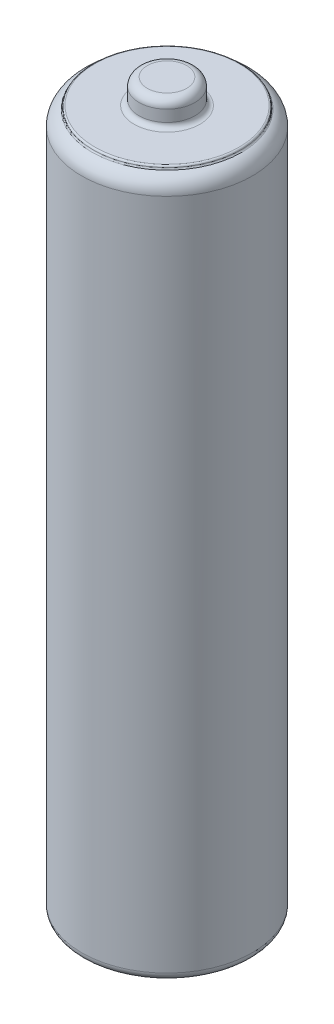
ISO-10303-21;
HEADER;
FILE_DESCRIPTION(('STEP AP214'),'2;1');
FILE_NAME('part.step','',(''),(''),'','','');
FILE_SCHEMA(('AUTOMOTIVE_DESIGN { 1 0 10303 214 1 1 1 1 }'));
ENDSEC;
DATA;
#1=APPLICATION_CONTEXT('core data for automotive mechanical design processes');
#2=APPLICATION_PROTOCOL_DEFINITION('international standard','automotive_design',2000,#1);
#3=PRODUCT_CONTEXT('',#1,'mechanical');
#4=PRODUCT('Part','Part','',(#3));
#5=PRODUCT_RELATED_PRODUCT_CATEGORY('part','',(#4));
#6=PRODUCT_DEFINITION_FORMATION('','',#4);
#7=PRODUCT_DEFINITION_CONTEXT('part definition',#1,'design');
#8=PRODUCT_DEFINITION('design','',#6,#7);
#9=PRODUCT_DEFINITION_SHAPE('','',#8);
#10=(LENGTH_UNIT() NAMED_UNIT(*) SI_UNIT(.MILLI.,.METRE.));
#11=(NAMED_UNIT(*) PLANE_ANGLE_UNIT() SI_UNIT($,.RADIAN.));
#12=(NAMED_UNIT(*) SI_UNIT($,.STERADIAN.) SOLID_ANGLE_UNIT());
#13=UNCERTAINTY_MEASURE_WITH_UNIT(LENGTH_MEASURE(1.E-05),#10,'distance_accuracy_value','');
#14=(GEOMETRIC_REPRESENTATION_CONTEXT(3) GLOBAL_UNCERTAINTY_ASSIGNED_CONTEXT((#13)) GLOBAL_UNIT_ASSIGNED_CONTEXT((#10,
#11,#12)) REPRESENTATION_CONTEXT('',''));
#15=CARTESIAN_POINT('',(0.,0.,0.));
#16=DIRECTION('',(0.,0.,1.));
#17=DIRECTION('',(1.,0.,0.));
#18=AXIS2_PLACEMENT_3D('',#15,#16,#17);
#19=CARTESIAN_POINT('',(0.,42.6,0.));
#20=DIRECTION('',(0.,1.,0.));
#21=DIRECTION('',(0.,0.,1.));
#22=AXIS2_PLACEMENT_3D('',#19,#20,#21);
#23=PLANE('',#22);
#24=CARTESIAN_POINT('',(0.,42.6,0.));
#25=DIRECTION('',(0.,1.,0.));
#26=DIRECTION('',(0.,0.,1.));
#27=AXIS2_PLACEMENT_3D('',#24,#25,#26);
#28=CIRCLE('',#27,2.);
#29=CARTESIAN_POINT('',(0.,42.6,2.));
#30=VERTEX_POINT('',#29);
#31=EDGE_CURVE('E53',#30,#30,#28,.F.);
#32=ORIENTED_EDGE('',*,*,#31,.T.);
#33=EDGE_LOOP('',(#32));
#34=FACE_BOUND('',#33,.T.);
#35=CARTESIAN_POINT('',(0.,42.6,0.));
#36=DIRECTION('',(0.,1.,0.));
#37=DIRECTION('',(0.,0.,1.));
#38=AXIS2_PLACEMENT_3D('',#35,#36,#37);
#39=CIRCLE('',#38,4.4);
#40=CARTESIAN_POINT('',(0.,42.6,4.4));
#41=VERTEX_POINT('',#40);
#42=EDGE_CURVE('E65',#41,#41,#39,.T.);
#43=ORIENTED_EDGE('',*,*,#42,.T.);
#44=EDGE_LOOP('',(#43));
#45=FACE_BOUND('',#44,.T.);
#46=ADVANCED_FACE('F33',(#34,#45),#23,.T.);
#47=CARTESIAN_POINT('',(0.,0.,0.));
#48=DIRECTION('',(0.,1.,0.));
#49=DIRECTION('',(0.,0.,1.));
#50=AXIS2_PLACEMENT_3D('',#47,#48,#49);
#51=PLANE('',#50);
#52=CARTESIAN_POINT('',(0.,0.,0.));
#53=DIRECTION('',(0.,1.,0.));
#54=DIRECTION('',(0.,0.,1.));
#55=AXIS2_PLACEMENT_3D('',#52,#53,#54);
#56=CIRCLE('',#55,4.7);
#57=CARTESIAN_POINT('',(0.,0.,4.7));
#58=VERTEX_POINT('',#57);
#59=EDGE_CURVE('E10',#58,#58,#56,.F.);
#60=ORIENTED_EDGE('',*,*,#59,.T.);
#61=EDGE_LOOP('',(#60));
#62=FACE_BOUND('',#61,.T.);
#63=CARTESIAN_POINT('',(0.,0.,0.));
#64=DIRECTION('',(0.,1.,0.));
#65=DIRECTION('',(0.,0.,1.));
#66=AXIS2_PLACEMENT_3D('',#63,#64,#65);
#67=CIRCLE('',#66,4.5);
#68=CARTESIAN_POINT('',(0.,0.,4.5));
#69=VERTEX_POINT('',#68);
#70=EDGE_CURVE('E77',#69,#69,#67,.F.);
#71=ORIENTED_EDGE('',*,*,#70,.F.);
#72=EDGE_LOOP('',(#71));
#73=FACE_BOUND('',#72,.T.);
#74=ADVANCED_FACE('F83',(#62,#73),#51,.F.);
#75=CARTESIAN_POINT('',(0.,42.4,0.));
#76=DIRECTION('',(0.,-1.,0.));
#77=DIRECTION('',(0.,0.,-1.));
#78=AXIS2_PLACEMENT_3D('',#75,#76,#77);
#79=CYLINDRICAL_SURFACE('',#78,5.2);
#80=CARTESIAN_POINT('',(0.,0.5,0.));
#81=DIRECTION('',(0.,1.,0.));
#82=DIRECTION('',(0.,0.,1.));
#83=AXIS2_PLACEMENT_3D('',#80,#81,#82);
#84=CIRCLE('',#83,5.2);
#85=CARTESIAN_POINT('',(0.,0.5,5.2));
#86=VERTEX_POINT('',#85);
#87=EDGE_CURVE('E40',#86,#86,#84,.T.);
#88=ORIENTED_EDGE('',*,*,#87,.T.);
#89=EDGE_LOOP('',(#88));
#90=FACE_BOUND('',#89,.T.);
#91=CARTESIAN_POINT('',(0.,41.475304923404,0.));
#92=DIRECTION('',(0.,-1.,0.));
#93=DIRECTION('',(0.,0.,-1.));
#94=AXIS2_PLACEMENT_3D('',#91,#92,#93);
#95=CIRCLE('',#94,5.2);
#96=CARTESIAN_POINT('',(0.,41.475304923404,-5.2));
#97=VERTEX_POINT('',#96);
#98=EDGE_CURVE('E59',#97,#97,#95,.T.);
#99=ORIENTED_EDGE('',*,*,#98,.T.);
#100=EDGE_LOOP('',(#99));
#101=FACE_BOUND('',#100,.T.);
#102=ADVANCED_FACE('F85',(#90,#101),#79,.T.);
#103=CARTESIAN_POINT('',(0.,-0.3,0.));
#104=DIRECTION('',(0.,1.,0.));
#105=DIRECTION('',(0.,0.,1.));
#106=AXIS2_PLACEMENT_3D('',#103,#104,#105);
#107=CYLINDRICAL_SURFACE('',#106,4.5);
#108=CARTESIAN_POINT('',(0.,-0.1,0.));
#109=DIRECTION('',(0.,-1.,0.));
#110=DIRECTION('',(0.,0.,-1.));
#111=AXIS2_PLACEMENT_3D('',#108,#109,#110);
#112=CIRCLE('',#111,4.5);
#113=CARTESIAN_POINT('',(0.,-0.1,-4.5));
#114=VERTEX_POINT('',#113);
#115=EDGE_CURVE('E44',#114,#114,#112,.F.);
#116=ORIENTED_EDGE('',*,*,#115,.T.);
#117=EDGE_LOOP('',(#116));
#118=FACE_BOUND('',#117,.T.);
#119=ORIENTED_EDGE('',*,*,#70,.T.);
#120=EDGE_LOOP('',(#119));
#121=FACE_BOUND('',#120,.T.);
#122=ADVANCED_FACE('F81',(#118,#121),#107,.T.);
#123=CARTESIAN_POINT('',(0.,-0.3,0.));
#124=DIRECTION('',(0.,-1.,0.));
#125=DIRECTION('',(0.,0.,-1.));
#126=AXIS2_PLACEMENT_3D('',#123,#124,#125);
#127=PLANE('',#126);
#128=CARTESIAN_POINT('',(0.,-0.3,0.));
#129=DIRECTION('',(0.,-1.,0.));
#130=DIRECTION('',(0.,0.,-1.));
#131=AXIS2_PLACEMENT_3D('',#128,#129,#130);
#132=CIRCLE('',#131,4.3);
#133=CARTESIAN_POINT('',(0.,-0.3,-4.3));
#134=VERTEX_POINT('',#133);
#135=EDGE_CURVE('E48',#134,#134,#132,.T.);
#136=ORIENTED_EDGE('',*,*,#135,.T.);
#137=EDGE_LOOP('',(#136));
#138=FACE_BOUND('',#137,.T.);
#139=ADVANCED_FACE('F128',(#138),#127,.T.);
#140=CARTESIAN_POINT('',(0.,44.1,0.));
#141=DIRECTION('',(0.,-1.,0.));
#142=DIRECTION('',(0.,0.,-1.));
#143=AXIS2_PLACEMENT_3D('',#140,#141,#142);
#144=CYLINDRICAL_SURFACE('',#143,1.7);
#145=CARTESIAN_POINT('',(0.,42.9,0.));
#146=DIRECTION('',(0.,1.,0.));
#147=DIRECTION('',(0.,0.,1.));
#148=AXIS2_PLACEMENT_3D('',#145,#146,#147);
#149=CIRCLE('',#148,1.7);
#150=CARTESIAN_POINT('',(0.,42.9,1.7));
#151=VERTEX_POINT('',#150);
#152=EDGE_CURVE('E56',#151,#151,#149,.T.);
#153=ORIENTED_EDGE('',*,*,#152,.T.);
#154=EDGE_LOOP('',(#153));
#155=FACE_BOUND('',#154,.T.);
#156=CARTESIAN_POINT('',(0.,43.6,0.));
#157=DIRECTION('',(0.,1.,0.));
#158=DIRECTION('',(0.,0.,1.));
#159=AXIS2_PLACEMENT_3D('',#156,#157,#158);
#160=CIRCLE('',#159,1.7);
#161=CARTESIAN_POINT('',(0.,43.6,1.7));
#162=VERTEX_POINT('',#161);
#163=EDGE_CURVE('E71',#162,#162,#160,.F.);
#164=ORIENTED_EDGE('',*,*,#163,.T.);
#165=EDGE_LOOP('',(#164));
#166=FACE_BOUND('',#165,.T.);
#167=ADVANCED_FACE('F130',(#155,#166),#144,.T.);
#168=CARTESIAN_POINT('',(0.,44.1,0.));
#169=DIRECTION('',(0.,1.,0.));
#170=DIRECTION('',(0.,0.,1.));
#171=AXIS2_PLACEMENT_3D('',#168,#169,#170);
#172=PLANE('',#171);
#173=CARTESIAN_POINT('',(0.,44.1,0.));
#174=DIRECTION('',(0.,1.,0.));
#175=DIRECTION('',(0.,0.,1.));
#176=AXIS2_PLACEMENT_3D('',#173,#174,#175);
#177=CIRCLE('',#176,1.2);
#178=CARTESIAN_POINT('',(0.,44.1,1.2));
#179=VERTEX_POINT('',#178);
#180=EDGE_CURVE('E74',#179,#179,#177,.T.);
#181=ORIENTED_EDGE('',*,*,#180,.T.);
#182=EDGE_LOOP('',(#181));
#183=FACE_BOUND('',#182,.T.);
#184=ADVANCED_FACE('F101',(#183),#172,.T.);
#185=CARTESIAN_POINT('',(0.,43.6,0.));
#186=DIRECTION('',(0.,1.,0.));
#187=DIRECTION('',(0.,0.,1.));
#188=AXIS2_PLACEMENT_3D('',#185,#186,#187);
#189=TOROIDAL_SURFACE('',#188,1.2,0.5);
#190=ORIENTED_EDGE('',*,*,#163,.F.);
#191=EDGE_LOOP('',(#190));
#192=FACE_BOUND('',#191,.T.);
#193=ORIENTED_EDGE('',*,*,#180,.F.);
#194=EDGE_LOOP('',(#193));
#195=FACE_BOUND('',#194,.T.);
#196=ADVANCED_FACE('F97',(#192,#195),#189,.T.);
#197=CARTESIAN_POINT('',(0.,42.5,0.));
#198=DIRECTION('',(0.,1.,0.));
#199=DIRECTION('',(0.,0.,1.));
#200=AXIS2_PLACEMENT_3D('',#197,#198,#199);
#201=TOROIDAL_SURFACE('',#200,4.6,0.1);
#202=CARTESIAN_POINT('',(0.,42.4068459021277,0.));
#203=DIRECTION('',(0.,1.,0.));
#204=DIRECTION('',(0.,0.,1.));
#205=AXIS2_PLACEMENT_3D('',#202,#203,#204);
#206=CIRCLE('',#205,4.5636363636364);
#207=CARTESIAN_POINT('',(0.,42.4068459021277,4.5636363636364));
#208=VERTEX_POINT('',#207);
#209=EDGE_CURVE('E62',#208,#208,#206,.T.);
#210=ORIENTED_EDGE('',*,*,#209,.T.);
#211=EDGE_LOOP('',(#210));
#212=FACE_BOUND('',#211,.T.);
#213=CARTESIAN_POINT('',(0.,42.5,0.));
#214=DIRECTION('',(0.,1.,0.));
#215=DIRECTION('',(0.,0.,1.));
#216=AXIS2_PLACEMENT_3D('',#213,#214,#215);
#217=CIRCLE('',#216,4.5);
#218=CARTESIAN_POINT('',(0.,42.5,4.5));
#219=VERTEX_POINT('',#218);
#220=EDGE_CURVE('E68',#219,#219,#217,.T.);
#221=ORIENTED_EDGE('',*,*,#220,.F.);
#222=EDGE_LOOP('',(#221));
#223=FACE_BOUND('',#222,.T.);
#224=ADVANCED_FACE('F100',(#212,#223),#201,.F.);
#225=CARTESIAN_POINT('',(0.,42.5,0.));
#226=DIRECTION('',(0.,1.,0.));
#227=DIRECTION('',(0.,0.,1.));
#228=AXIS2_PLACEMENT_3D('',#225,#226,#227);
#229=TOROIDAL_SURFACE('',#228,4.4,0.1);
#230=ORIENTED_EDGE('',*,*,#220,.T.);
#231=EDGE_LOOP('',(#230));
#232=FACE_BOUND('',#231,.T.);
#233=ORIENTED_EDGE('',*,*,#42,.F.);
#234=EDGE_LOOP('',(#233));
#235=FACE_BOUND('',#234,.T.);
#236=ADVANCED_FACE('F105',(#232,#235),#229,.T.);
#237=CARTESIAN_POINT('',(0.,41.475304923404,0.));
#238=DIRECTION('',(0.,-1.,0.));
#239=DIRECTION('',(0.,0.,-1.));
#240=AXIS2_PLACEMENT_3D('',#237,#238,#239);
#241=TOROIDAL_SURFACE('',#240,4.2,1.);
#242=ORIENTED_EDGE('',*,*,#98,.F.);
#243=EDGE_LOOP('',(#242));
#244=FACE_BOUND('',#243,.T.);
#245=ORIENTED_EDGE('',*,*,#209,.F.);
#246=EDGE_LOOP('',(#245));
#247=FACE_BOUND('',#246,.T.);
#248=ADVANCED_FACE('F109',(#244,#247),#241,.T.);
#249=CARTESIAN_POINT('',(0.,42.9,0.));
#250=DIRECTION('',(0.,1.,0.));
#251=DIRECTION('',(0.,0.,1.));
#252=AXIS2_PLACEMENT_3D('',#249,#250,#251);
#253=TOROIDAL_SURFACE('',#252,2.,0.3);
#254=ORIENTED_EDGE('',*,*,#31,.F.);
#255=EDGE_LOOP('',(#254));
#256=FACE_BOUND('',#255,.T.);
#257=ORIENTED_EDGE('',*,*,#152,.F.);
#258=EDGE_LOOP('',(#257));
#259=FACE_BOUND('',#258,.T.);
#260=ADVANCED_FACE('F113',(#256,#259),#253,.F.);
#261=CARTESIAN_POINT('',(0.,-0.1,0.));
#262=DIRECTION('',(0.,-1.,0.));
#263=DIRECTION('',(0.,0.,-1.));
#264=AXIS2_PLACEMENT_3D('',#261,#262,#263);
#265=TOROIDAL_SURFACE('',#264,4.3,0.2);
#266=ORIENTED_EDGE('',*,*,#115,.F.);
#267=EDGE_LOOP('',(#266));
#268=FACE_BOUND('',#267,.T.);
#269=ORIENTED_EDGE('',*,*,#135,.F.);
#270=EDGE_LOOP('',(#269));
#271=FACE_BOUND('',#270,.T.);
#272=ADVANCED_FACE('F116',(#268,#271),#265,.T.);
#273=CARTESIAN_POINT('',(0.,0.5,0.));
#274=DIRECTION('',(0.,1.,0.));
#275=DIRECTION('',(0.,0.,1.));
#276=AXIS2_PLACEMENT_3D('',#273,#274,#275);
#277=TOROIDAL_SURFACE('',#276,4.7,0.5);
#278=ORIENTED_EDGE('',*,*,#59,.F.);
#279=EDGE_LOOP('',(#278));
#280=FACE_BOUND('',#279,.T.);
#281=ORIENTED_EDGE('',*,*,#87,.F.);
#282=EDGE_LOOP('',(#281));
#283=FACE_BOUND('',#282,.T.);
#284=ADVANCED_FACE('F35',(#280,#283),#277,.T.);
#285=CLOSED_SHELL('',(#46,#74,#102,#122,#139,#167,#184,#196,#224,#236,#248,#260,#272,#284));
#286=MANIFOLD_SOLID_BREP('B2',#285);
#287=ADVANCED_BREP_SHAPE_REPRESENTATION('',(#18,#286),#14);
#288=SHAPE_DEFINITION_REPRESENTATION(#9,#287);
ENDSEC;
END-ISO-10303-21;
